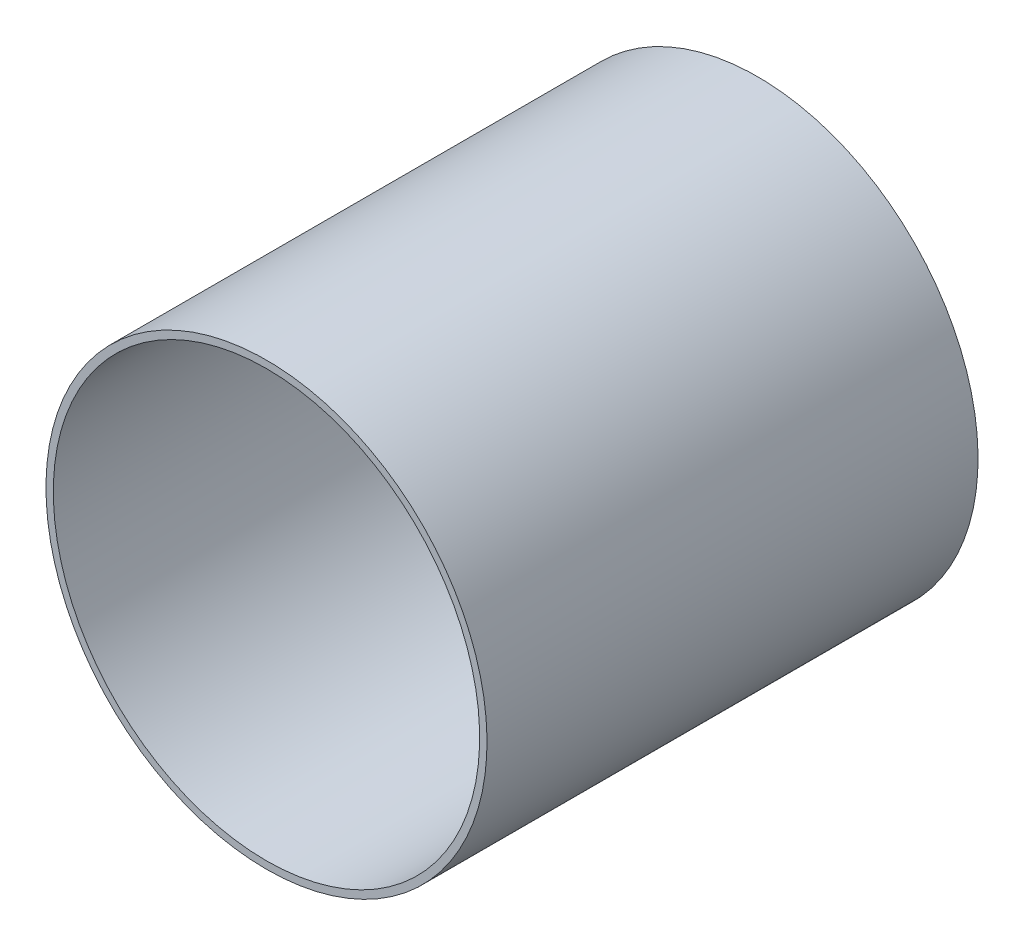
ISO-10303-21;
HEADER;
FILE_DESCRIPTION(('STEP AP214'),'2;1');
FILE_NAME('part.step','',(''),(''),'','','');
FILE_SCHEMA(('AUTOMOTIVE_DESIGN { 1 0 10303 214 1 1 1 1 }'));
ENDSEC;
DATA;
#1=APPLICATION_CONTEXT('core data for automotive mechanical design processes');
#2=APPLICATION_PROTOCOL_DEFINITION('international standard','automotive_design',2000,#1);
#3=PRODUCT_CONTEXT('',#1,'mechanical');
#4=PRODUCT('Part','Part','',(#3));
#5=PRODUCT_RELATED_PRODUCT_CATEGORY('part','',(#4));
#6=PRODUCT_DEFINITION_FORMATION('','',#4);
#7=PRODUCT_DEFINITION_CONTEXT('part definition',#1,'design');
#8=PRODUCT_DEFINITION('design','',#6,#7);
#9=PRODUCT_DEFINITION_SHAPE('','',#8);
#10=(LENGTH_UNIT() NAMED_UNIT(*) SI_UNIT(.MILLI.,.METRE.));
#11=(NAMED_UNIT(*) PLANE_ANGLE_UNIT() SI_UNIT($,.RADIAN.));
#12=(NAMED_UNIT(*) SI_UNIT($,.STERADIAN.) SOLID_ANGLE_UNIT());
#13=UNCERTAINTY_MEASURE_WITH_UNIT(LENGTH_MEASURE(1.E-05),#10,'distance_accuracy_value','');
#14=(GEOMETRIC_REPRESENTATION_CONTEXT(3) GLOBAL_UNCERTAINTY_ASSIGNED_CONTEXT((#13)) GLOBAL_UNIT_ASSIGNED_CONTEXT((#10,
#11,#12)) REPRESENTATION_CONTEXT('',''));
#15=CARTESIAN_POINT('',(0.,0.,0.));
#16=DIRECTION('',(0.,0.,1.));
#17=DIRECTION('',(1.,0.,0.));
#18=AXIS2_PLACEMENT_3D('',#15,#16,#17);
#19=CARTESIAN_POINT('',(-3.4641,2.,-0.045));
#20=DIRECTION('',(0.,0.,-1.));
#21=DIRECTION('',(0.,-1.,0.));
#22=AXIS2_PLACEMENT_3D('',#19,#20,#21);
#23=CYLINDRICAL_SURFACE('',#22,0.725);
#24=CARTESIAN_POINT('',(-3.4641,2.,-0.035));
#25=DIRECTION('',(0.,0.,-1.));
#26=DIRECTION('',(0.,-1.,0.));
#27=AXIS2_PLACEMENT_3D('',#24,#25,#26);
#28=CIRCLE('',#27,0.725);
#29=CARTESIAN_POINT('',(-3.4641,1.275,-0.035));
#30=VERTEX_POINT('',#29);
#31=EDGE_CURVE('E64',#30,#30,#28,.T.);
#32=ORIENTED_EDGE('',*,*,#31,.T.);
#33=DIRECTION('',(0.,0.,1.));
#34=VECTOR('',#33,1.);
#35=CARTESIAN_POINT('',(-3.4641,1.275,-0.045));
#36=LINE('',#35,#34);
#37=CARTESIAN_POINT('',(-3.4641,1.275,1.635));
#38=VERTEX_POINT('',#37);
#39=EDGE_CURVE('E11',#30,#38,#36,.T.);
#40=ORIENTED_EDGE('',*,*,#39,.T.);
#41=CARTESIAN_POINT('',(-3.4641,2.,1.635));
#42=DIRECTION('',(0.,0.,-1.));
#43=DIRECTION('',(0.,-1.,0.));
#44=AXIS2_PLACEMENT_3D('',#41,#42,#43);
#45=CIRCLE('',#44,0.725);
#46=EDGE_CURVE('E25',#38,#38,#45,.T.);
#47=ORIENTED_EDGE('',*,*,#46,.F.);
#48=ORIENTED_EDGE('',*,*,#39,.F.);
#49=EDGE_LOOP('',(#32,#40,#47,#48));
#50=FACE_BOUND('',#49,.T.);
#51=ADVANCED_FACE('F17',(#50),#23,.F.);
#52=CARTESIAN_POINT('',(-3.4641,1.25,1.635));
#53=DIRECTION('',(0.,0.,1.));
#54=DIRECTION('',(1.,0.,0.));
#55=AXIS2_PLACEMENT_3D('',#52,#53,#54);
#56=PLANE('',#55);
#57=ORIENTED_EDGE('',*,*,#46,.T.);
#58=EDGE_LOOP('',(#57));
#59=FACE_BOUND('',#58,.T.);
#60=CARTESIAN_POINT('',(-3.4641,2.,1.635));
#61=DIRECTION('',(0.,0.,1.));
#62=DIRECTION('',(0.,-1.,0.));
#63=AXIS2_PLACEMENT_3D('',#60,#61,#62);
#64=CIRCLE('',#63,0.75);
#65=CARTESIAN_POINT('',(-3.4641,1.25,1.635));
#66=VERTEX_POINT('',#65);
#67=EDGE_CURVE('E56',#66,#66,#64,.T.);
#68=ORIENTED_EDGE('',*,*,#67,.T.);
#69=EDGE_LOOP('',(#68));
#70=FACE_BOUND('',#69,.T.);
#71=ADVANCED_FACE('F73',(#59,#70),#56,.T.);
#72=CARTESIAN_POINT('',(-3.4641,1.25,-0.035));
#73=DIRECTION('',(0.,0.,1.));
#74=DIRECTION('',(1.,0.,0.));
#75=AXIS2_PLACEMENT_3D('',#72,#73,#74);
#76=PLANE('',#75);
#77=ORIENTED_EDGE('',*,*,#31,.F.);
#78=EDGE_LOOP('',(#77));
#79=FACE_BOUND('',#78,.T.);
#80=CARTESIAN_POINT('',(-3.4641,2.,-0.035));
#81=DIRECTION('',(0.,0.,1.));
#82=DIRECTION('',(0.,-1.,0.));
#83=AXIS2_PLACEMENT_3D('',#80,#81,#82);
#84=CIRCLE('',#83,0.75);
#85=CARTESIAN_POINT('',(-3.4641,1.25,-0.035));
#86=VERTEX_POINT('',#85);
#87=EDGE_CURVE('E55',#86,#86,#84,.T.);
#88=ORIENTED_EDGE('',*,*,#87,.F.);
#89=EDGE_LOOP('',(#88));
#90=FACE_BOUND('',#89,.T.);
#91=ADVANCED_FACE('F81',(#79,#90),#76,.F.);
#92=CARTESIAN_POINT('',(-3.4641,2.,-0.035));
#93=DIRECTION('',(0.,0.,-1.));
#94=DIRECTION('',(0.,-1.,0.));
#95=AXIS2_PLACEMENT_3D('',#92,#93,#94);
#96=CYLINDRICAL_SURFACE('',#95,0.75);
#97=ORIENTED_EDGE('',*,*,#87,.T.);
#98=DIRECTION('',(0.,0.,1.));
#99=VECTOR('',#98,1.);
#100=CARTESIAN_POINT('',(-3.4641,1.25,-0.035));
#101=LINE('',#100,#99);
#102=EDGE_CURVE('E52',#86,#66,#101,.T.);
#103=ORIENTED_EDGE('',*,*,#102,.T.);
#104=ORIENTED_EDGE('',*,*,#67,.F.);
#105=ORIENTED_EDGE('',*,*,#102,.F.);
#106=EDGE_LOOP('',(#97,#103,#104,#105));
#107=FACE_BOUND('',#106,.T.);
#108=ADVANCED_FACE('F53',(#107),#96,.T.);
#109=CLOSED_SHELL('',(#51,#71,#91,#108));
#110=MANIFOLD_SOLID_BREP('B1',#109);
#111=ADVANCED_BREP_SHAPE_REPRESENTATION('',(#18,#110),#14);
#112=SHAPE_DEFINITION_REPRESENTATION(#9,#111);
ENDSEC;
END-ISO-10303-21;
